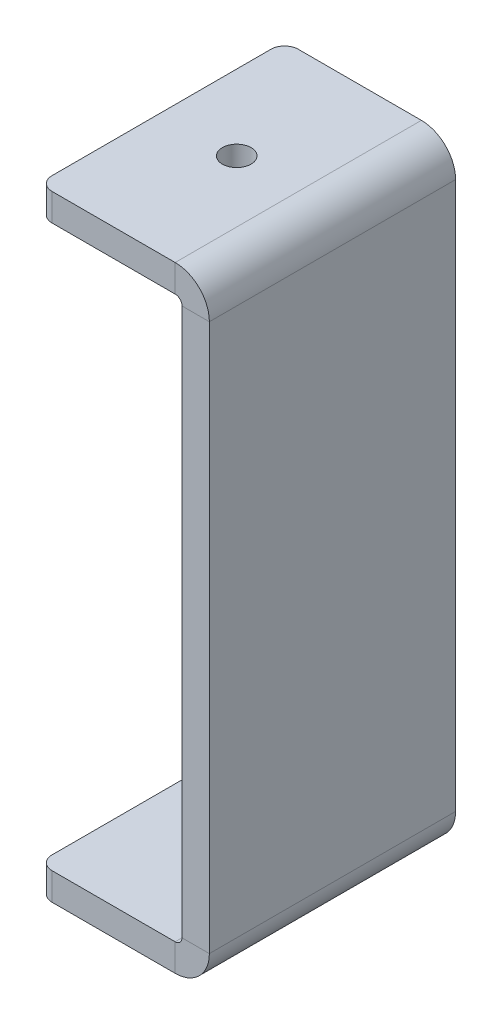
ISO-10303-21;
HEADER;
FILE_DESCRIPTION(('STEP AP214'),'2;1');
FILE_NAME('part.step','',(''),(''),'','','');
FILE_SCHEMA(('AUTOMOTIVE_DESIGN { 1 0 10303 214 1 1 1 1 }'));
ENDSEC;
DATA;
#1=APPLICATION_CONTEXT('core data for automotive mechanical design processes');
#2=APPLICATION_PROTOCOL_DEFINITION('international standard','automotive_design',2000,#1);
#3=PRODUCT_CONTEXT('',#1,'mechanical');
#4=PRODUCT('Part','Part','',(#3));
#5=PRODUCT_RELATED_PRODUCT_CATEGORY('part','',(#4));
#6=PRODUCT_DEFINITION_FORMATION('','',#4);
#7=PRODUCT_DEFINITION_CONTEXT('part definition',#1,'design');
#8=PRODUCT_DEFINITION('design','',#6,#7);
#9=PRODUCT_DEFINITION_SHAPE('','',#8);
#10=(LENGTH_UNIT() NAMED_UNIT(*) SI_UNIT(.MILLI.,.METRE.));
#11=(NAMED_UNIT(*) PLANE_ANGLE_UNIT() SI_UNIT($,.RADIAN.));
#12=(NAMED_UNIT(*) SI_UNIT($,.STERADIAN.) SOLID_ANGLE_UNIT());
#13=UNCERTAINTY_MEASURE_WITH_UNIT(LENGTH_MEASURE(1.E-05),#10,'distance_accuracy_value','');
#14=(GEOMETRIC_REPRESENTATION_CONTEXT(3) GLOBAL_UNCERTAINTY_ASSIGNED_CONTEXT((#13)) GLOBAL_UNIT_ASSIGNED_CONTEXT((#10,
#11,#12)) REPRESENTATION_CONTEXT('',''));
#15=CARTESIAN_POINT('',(0.,0.,0.));
#16=DIRECTION('',(0.,0.,1.));
#17=DIRECTION('',(1.,0.,0.));
#18=AXIS2_PLACEMENT_3D('',#15,#16,#17);
#19=CARTESIAN_POINT('',(0.,-45.,18.));
#20=DIRECTION('',(0.,1.,0.));
#21=DIRECTION('',(0.,0.,1.));
#22=AXIS2_PLACEMENT_3D('',#19,#20,#21);
#23=PLANE('',#22);
#24=DIRECTION('',(0.,0.,-1.));
#25=VECTOR('',#24,1.);
#26=CARTESIAN_POINT('',(-25.,-45.,18.));
#27=LINE('',#26,#25);
#28=CARTESIAN_POINT('',(-25.,-45.,16.));
#29=VERTEX_POINT('',#28);
#30=CARTESIAN_POINT('',(-25.,-45.,-16.));
#31=VERTEX_POINT('',#30);
#32=EDGE_CURVE('E244',#29,#31,#27,.T.);
#33=ORIENTED_EDGE('',*,*,#32,.T.);
#34=CARTESIAN_POINT('',(-23.,-45.,-16.));
#35=DIRECTION('',(0.,1.,0.));
#36=DIRECTION('',(0.,0.,1.));
#37=AXIS2_PLACEMENT_3D('',#34,#35,#36);
#38=CIRCLE('',#37,2.);
#39=CARTESIAN_POINT('',(-23.,-45.,-18.));
#40=VERTEX_POINT('',#39);
#41=EDGE_CURVE('E288',#31,#40,#38,.F.);
#42=ORIENTED_EDGE('',*,*,#41,.T.);
#43=DIRECTION('',(1.,0.,0.));
#44=VECTOR('',#43,1.);
#45=CARTESIAN_POINT('',(0.,-45.,-18.));
#46=LINE('',#45,#44);
#47=CARTESIAN_POINT('',(-4.99999999999999,-45.,-18.));
#48=VERTEX_POINT('',#47);
#49=EDGE_CURVE('E222',#40,#48,#46,.T.);
#50=ORIENTED_EDGE('',*,*,#49,.T.);
#51=DIRECTION('',(0.,0.,-1.));
#52=VECTOR('',#51,1.);
#53=CARTESIAN_POINT('',(-4.99999999999999,-45.,18.));
#54=LINE('',#53,#52);
#55=CARTESIAN_POINT('',(-4.99999999999999,-45.,18.));
#56=VERTEX_POINT('',#55);
#57=EDGE_CURVE('E241',#56,#48,#54,.T.);
#58=ORIENTED_EDGE('',*,*,#57,.F.);
#59=DIRECTION('',(1.,0.,0.));
#60=VECTOR('',#59,1.);
#61=CARTESIAN_POINT('',(0.,-45.,18.));
#62=LINE('',#61,#60);
#63=CARTESIAN_POINT('',(-23.,-45.,18.));
#64=VERTEX_POINT('',#63);
#65=EDGE_CURVE('E197',#64,#56,#62,.T.);
#66=ORIENTED_EDGE('',*,*,#65,.F.);
#67=CARTESIAN_POINT('',(-23.,-45.,16.));
#68=DIRECTION('',(0.,1.,0.));
#69=DIRECTION('',(0.,0.,1.));
#70=AXIS2_PLACEMENT_3D('',#67,#68,#69);
#71=CIRCLE('',#70,2.);
#72=EDGE_CURVE('E286',#64,#29,#71,.F.);
#73=ORIENTED_EDGE('',*,*,#72,.T.);
#74=EDGE_LOOP('',(#33,#42,#50,#58,#66,#73));
#75=FACE_BOUND('',#74,.T.);
#76=CARTESIAN_POINT('',(-14.,-45.,0.));
#77=DIRECTION('',(0.,-1.,0.));
#78=DIRECTION('',(0.,0.,-1.));
#79=AXIS2_PLACEMENT_3D('',#76,#77,#78);
#80=CIRCLE('',#79,2.1);
#81=CARTESIAN_POINT('',(-14.,-45.,-2.1));
#82=VERTEX_POINT('',#81);
#83=EDGE_CURVE('E328',#82,#82,#80,.T.);
#84=ORIENTED_EDGE('',*,*,#83,.F.);
#85=EDGE_LOOP('',(#84));
#86=FACE_BOUND('',#85,.T.);
#87=ADVANCED_FACE('F39',(#75,#86),#23,.F.);
#88=CARTESIAN_POINT('',(0.,45.,18.));
#89=DIRECTION('',(0.,-1.,0.));
#90=DIRECTION('',(0.,0.,-1.));
#91=AXIS2_PLACEMENT_3D('',#88,#89,#90);
#92=PLANE('',#91);
#93=DIRECTION('',(-1.,0.,0.));
#94=VECTOR('',#93,1.);
#95=CARTESIAN_POINT('',(0.,45.,-18.));
#96=LINE('',#95,#94);
#97=CARTESIAN_POINT('',(-4.99999999999999,45.,-18.));
#98=VERTEX_POINT('',#97);
#99=CARTESIAN_POINT('',(-23.,45.,-18.));
#100=VERTEX_POINT('',#99);
#101=EDGE_CURVE('E207',#98,#100,#96,.T.);
#102=ORIENTED_EDGE('',*,*,#101,.T.);
#103=CARTESIAN_POINT('',(-23.,45.,-16.));
#104=DIRECTION('',(0.,-1.,0.));
#105=DIRECTION('',(0.,0.,-1.));
#106=AXIS2_PLACEMENT_3D('',#103,#104,#105);
#107=CIRCLE('',#106,2.);
#108=CARTESIAN_POINT('',(-25.,45.,-16.));
#109=VERTEX_POINT('',#108);
#110=EDGE_CURVE('E297',#100,#109,#107,.F.);
#111=ORIENTED_EDGE('',*,*,#110,.T.);
#112=DIRECTION('',(0.,0.,-1.));
#113=VECTOR('',#112,1.);
#114=CARTESIAN_POINT('',(-25.,45.,18.));
#115=LINE('',#114,#113);
#116=CARTESIAN_POINT('',(-25.,45.,16.));
#117=VERTEX_POINT('',#116);
#118=EDGE_CURVE('E258',#117,#109,#115,.T.);
#119=ORIENTED_EDGE('',*,*,#118,.F.);
#120=CARTESIAN_POINT('',(-23.,45.,16.));
#121=DIRECTION('',(0.,-1.,0.));
#122=DIRECTION('',(0.,0.,-1.));
#123=AXIS2_PLACEMENT_3D('',#120,#121,#122);
#124=CIRCLE('',#123,2.);
#125=CARTESIAN_POINT('',(-23.,45.,18.));
#126=VERTEX_POINT('',#125);
#127=EDGE_CURVE('E295',#117,#126,#124,.F.);
#128=ORIENTED_EDGE('',*,*,#127,.T.);
#129=DIRECTION('',(-1.,0.,0.));
#130=VECTOR('',#129,1.);
#131=CARTESIAN_POINT('',(0.,45.,18.));
#132=LINE('',#131,#130);
#133=CARTESIAN_POINT('',(-4.99999999999999,45.,18.));
#134=VERTEX_POINT('',#133);
#135=EDGE_CURVE('E182',#134,#126,#132,.T.);
#136=ORIENTED_EDGE('',*,*,#135,.F.);
#137=DIRECTION('',(0.,0.,-1.));
#138=VECTOR('',#137,1.);
#139=CARTESIAN_POINT('',(-4.99999999999999,45.,18.));
#140=LINE('',#139,#138);
#141=EDGE_CURVE('E206',#134,#98,#140,.T.);
#142=ORIENTED_EDGE('',*,*,#141,.T.);
#143=EDGE_LOOP('',(#102,#111,#119,#128,#136,#142));
#144=FACE_BOUND('',#143,.T.);
#145=CARTESIAN_POINT('',(-14.,45.,0.));
#146=DIRECTION('',(0.,1.,0.));
#147=DIRECTION('',(0.,0.,1.));
#148=AXIS2_PLACEMENT_3D('',#145,#146,#147);
#149=CIRCLE('',#148,2.1);
#150=CARTESIAN_POINT('',(-14.,45.,2.1));
#151=VERTEX_POINT('',#150);
#152=EDGE_CURVE('E322',#151,#151,#149,.T.);
#153=ORIENTED_EDGE('',*,*,#152,.F.);
#154=EDGE_LOOP('',(#153));
#155=FACE_BOUND('',#154,.T.);
#156=ADVANCED_FACE('F313',(#144,#155),#92,.F.);
#157=CARTESIAN_POINT('',(-4.99999999999999,-45.,18.));
#158=DIRECTION('',(0.,0.,1.));
#159=DIRECTION('',(1.,0.,0.));
#160=AXIS2_PLACEMENT_3D('',#157,#158,#159);
#161=PLANE('',#160);
#162=DIRECTION('',(0.,1.,0.));
#163=VECTOR('',#162,1.);
#164=CARTESIAN_POINT('',(-4.99999999999999,-45.,18.));
#165=LINE('',#164,#163);
#166=CARTESIAN_POINT('',(-4.99999999999999,-41.,18.));
#167=VERTEX_POINT('',#166);
#168=EDGE_CURVE('E271',#56,#167,#165,.T.);
#169=ORIENTED_EDGE('',*,*,#168,.F.);
#170=CARTESIAN_POINT('',(-4.99999999999999,-40.,18.));
#171=DIRECTION('',(0.,0.,-1.));
#172=DIRECTION('',(-1.,0.,0.));
#173=AXIS2_PLACEMENT_3D('',#170,#171,#172);
#174=CIRCLE('',#173,5.);
#175=CARTESIAN_POINT('',(0.,-39.9999999999999,18.));
#176=VERTEX_POINT('',#175);
#177=EDGE_CURVE('E199',#56,#176,#174,.F.);
#178=ORIENTED_EDGE('',*,*,#177,.T.);
#179=DIRECTION('',(1.,0.,0.));
#180=VECTOR('',#179,1.);
#181=CARTESIAN_POINT('',(-3.99999999999999,-39.9999999999999,18.));
#182=LINE('',#181,#180);
#183=CARTESIAN_POINT('',(-3.99999999999999,-39.9999999999999,18.));
#184=VERTEX_POINT('',#183);
#185=EDGE_CURVE('E269',#184,#176,#182,.T.);
#186=ORIENTED_EDGE('',*,*,#185,.F.);
#187=CARTESIAN_POINT('',(-4.99999999999999,-40.,18.));
#188=DIRECTION('',(0.,0.,1.));
#189=DIRECTION('',(1.,0.,0.));
#190=AXIS2_PLACEMENT_3D('',#187,#188,#189);
#191=CIRCLE('',#190,1.);
#192=EDGE_CURVE('E189',#167,#184,#191,.T.);
#193=ORIENTED_EDGE('',*,*,#192,.F.);
#194=EDGE_LOOP('',(#169,#178,#186,#193));
#195=FACE_BOUND('',#194,.T.);
#196=ADVANCED_FACE('F341',(#195),#161,.T.);
#197=CARTESIAN_POINT('',(-3.99999999999999,-39.9999999999999,18.));
#198=DIRECTION('',(0.,0.,1.));
#199=DIRECTION('',(1.,0.,0.));
#200=AXIS2_PLACEMENT_3D('',#197,#198,#199);
#201=PLANE('',#200);
#202=DIRECTION('',(1.,0.,0.));
#203=VECTOR('',#202,1.);
#204=CARTESIAN_POINT('',(0.,-41.,18.));
#205=LINE('',#204,#203);
#206=CARTESIAN_POINT('',(-23.,-41.,18.));
#207=VERTEX_POINT('',#206);
#208=EDGE_CURVE('E195',#207,#167,#205,.T.);
#209=ORIENTED_EDGE('',*,*,#208,.F.);
#210=DIRECTION('',(0.,1.,0.));
#211=VECTOR('',#210,1.);
#212=CARTESIAN_POINT('',(-23.,-39.9999999999999,18.));
#213=LINE('',#212,#211);
#214=EDGE_CURVE('E290',#207,#64,#213,.F.);
#215=ORIENTED_EDGE('',*,*,#214,.T.);
#216=ORIENTED_EDGE('',*,*,#65,.T.);
#217=ORIENTED_EDGE('',*,*,#168,.T.);
#218=EDGE_LOOP('',(#209,#215,#216,#217));
#219=FACE_BOUND('',#218,.T.);
#220=ADVANCED_FACE('F389',(#219),#201,.T.);
#221=CARTESIAN_POINT('',(0.,-39.9999999999999,-18.));
#222=DIRECTION('',(0.,0.,-1.));
#223=DIRECTION('',(-1.,0.,0.));
#224=AXIS2_PLACEMENT_3D('',#221,#222,#223);
#225=PLANE('',#224);
#226=DIRECTION('',(-1.,0.,0.));
#227=VECTOR('',#226,1.);
#228=CARTESIAN_POINT('',(0.,-39.9999999999999,-18.));
#229=LINE('',#228,#227);
#230=CARTESIAN_POINT('',(0.,-39.9999999999999,-18.));
#231=VERTEX_POINT('',#230);
#232=CARTESIAN_POINT('',(-3.99999999999999,-39.9999999999999,-18.));
#233=VERTEX_POINT('',#232);
#234=EDGE_CURVE('E267',#231,#233,#229,.T.);
#235=ORIENTED_EDGE('',*,*,#234,.F.);
#236=CARTESIAN_POINT('',(-4.99999999999999,-40.,-18.));
#237=DIRECTION('',(0.,0.,-1.));
#238=DIRECTION('',(-1.,0.,0.));
#239=AXIS2_PLACEMENT_3D('',#236,#237,#238);
#240=CIRCLE('',#239,5.);
#241=EDGE_CURVE('E224',#48,#231,#240,.F.);
#242=ORIENTED_EDGE('',*,*,#241,.F.);
#243=DIRECTION('',(0.,-1.,0.));
#244=VECTOR('',#243,1.);
#245=CARTESIAN_POINT('',(-4.99999999999999,-41.,-18.));
#246=LINE('',#245,#244);
#247=CARTESIAN_POINT('',(-4.99999999999999,-41.,-18.));
#248=VERTEX_POINT('',#247);
#249=EDGE_CURVE('E264',#248,#48,#246,.T.);
#250=ORIENTED_EDGE('',*,*,#249,.F.);
#251=CARTESIAN_POINT('',(-4.99999999999999,-40.,-18.));
#252=DIRECTION('',(0.,0.,1.));
#253=DIRECTION('',(1.,0.,0.));
#254=AXIS2_PLACEMENT_3D('',#251,#252,#253);
#255=CIRCLE('',#254,1.);
#256=EDGE_CURVE('E217',#248,#233,#255,.T.);
#257=ORIENTED_EDGE('',*,*,#256,.T.);
#258=EDGE_LOOP('',(#235,#242,#250,#257));
#259=FACE_BOUND('',#258,.T.);
#260=ADVANCED_FACE('F385',(#259),#225,.T.);
#261=CARTESIAN_POINT('',(-4.99999999999999,-41.,-18.));
#262=DIRECTION('',(0.,0.,-1.));
#263=DIRECTION('',(-1.,0.,0.));
#264=AXIS2_PLACEMENT_3D('',#261,#262,#263);
#265=PLANE('',#264);
#266=DIRECTION('',(0.,1.,0.));
#267=VECTOR('',#266,1.);
#268=CARTESIAN_POINT('',(0.,45.,-18.));
#269=LINE('',#268,#267);
#270=CARTESIAN_POINT('',(0.,40.,-18.));
#271=VERTEX_POINT('',#270);
#272=EDGE_CURVE('E227',#231,#271,#269,.T.);
#273=ORIENTED_EDGE('',*,*,#272,.F.);
#274=ORIENTED_EDGE('',*,*,#234,.T.);
#275=DIRECTION('',(0.,1.,0.));
#276=VECTOR('',#275,1.);
#277=CARTESIAN_POINT('',(-3.99999999999999,45.,-18.));
#278=LINE('',#277,#276);
#279=CARTESIAN_POINT('',(-3.99999999999999,40.,-18.));
#280=VERTEX_POINT('',#279);
#281=EDGE_CURVE('E214',#233,#280,#278,.T.);
#282=ORIENTED_EDGE('',*,*,#281,.T.);
#283=DIRECTION('',(1.,0.,0.));
#284=VECTOR('',#283,1.);
#285=CARTESIAN_POINT('',(-3.99999999999999,40.,-18.));
#286=LINE('',#285,#284);
#287=EDGE_CURVE('E260',#280,#271,#286,.T.);
#288=ORIENTED_EDGE('',*,*,#287,.T.);
#289=EDGE_LOOP('',(#273,#274,#282,#288));
#290=FACE_BOUND('',#289,.T.);
#291=ADVANCED_FACE('F382',(#290),#265,.T.);
#292=CARTESIAN_POINT('',(0.,40.,18.));
#293=DIRECTION('',(0.,0.,1.));
#294=DIRECTION('',(1.,0.,0.));
#295=AXIS2_PLACEMENT_3D('',#292,#293,#294);
#296=PLANE('',#295);
#297=DIRECTION('',(-1.,0.,0.));
#298=VECTOR('',#297,1.);
#299=CARTESIAN_POINT('',(0.,40.,18.));
#300=LINE('',#299,#298);
#301=CARTESIAN_POINT('',(0.,40.,18.));
#302=VERTEX_POINT('',#301);
#303=CARTESIAN_POINT('',(-3.99999999999999,40.,18.));
#304=VERTEX_POINT('',#303);
#305=EDGE_CURVE('E163',#302,#304,#300,.T.);
#306=ORIENTED_EDGE('',*,*,#305,.F.);
#307=CARTESIAN_POINT('',(-4.99999999999999,40.,18.));
#308=DIRECTION('',(0.,0.,-1.));
#309=DIRECTION('',(-1.,0.,0.));
#310=AXIS2_PLACEMENT_3D('',#307,#308,#309);
#311=CIRCLE('',#310,5.);
#312=EDGE_CURVE('E161',#302,#134,#311,.F.);
#313=ORIENTED_EDGE('',*,*,#312,.T.);
#314=DIRECTION('',(0.,1.,0.));
#315=VECTOR('',#314,1.);
#316=CARTESIAN_POINT('',(-4.99999999999999,41.,18.));
#317=LINE('',#316,#315);
#318=CARTESIAN_POINT('',(-4.99999999999999,41.,18.));
#319=VERTEX_POINT('',#318);
#320=EDGE_CURVE('E154',#319,#134,#317,.T.);
#321=ORIENTED_EDGE('',*,*,#320,.F.);
#322=CARTESIAN_POINT('',(-4.99999999999999,40.,18.));
#323=DIRECTION('',(0.,0.,1.));
#324=DIRECTION('',(1.,0.,0.));
#325=AXIS2_PLACEMENT_3D('',#322,#323,#324);
#326=CIRCLE('',#325,1.);
#327=EDGE_CURVE('E158',#304,#319,#326,.T.);
#328=ORIENTED_EDGE('',*,*,#327,.F.);
#329=EDGE_LOOP('',(#306,#313,#321,#328));
#330=FACE_BOUND('',#329,.T.);
#331=ADVANCED_FACE('F156',(#330),#296,.T.);
#332=CARTESIAN_POINT('',(-4.99999999999999,41.,18.));
#333=DIRECTION('',(0.,0.,1.));
#334=DIRECTION('',(1.,0.,0.));
#335=AXIS2_PLACEMENT_3D('',#332,#333,#334);
#336=PLANE('',#335);
#337=DIRECTION('',(0.,1.,0.));
#338=VECTOR('',#337,1.);
#339=CARTESIAN_POINT('',(0.,45.,18.));
#340=LINE('',#339,#338);
#341=EDGE_CURVE('E202',#176,#302,#340,.T.);
#342=ORIENTED_EDGE('',*,*,#341,.T.);
#343=ORIENTED_EDGE('',*,*,#305,.T.);
#344=DIRECTION('',(0.,1.,0.));
#345=VECTOR('',#344,1.);
#346=CARTESIAN_POINT('',(-3.99999999999999,45.,18.));
#347=LINE('',#346,#345);
#348=EDGE_CURVE('E187',#184,#304,#347,.T.);
#349=ORIENTED_EDGE('',*,*,#348,.F.);
#350=ORIENTED_EDGE('',*,*,#185,.T.);
#351=EDGE_LOOP('',(#342,#343,#349,#350));
#352=FACE_BOUND('',#351,.T.);
#353=ADVANCED_FACE('F375',(#352),#336,.T.);
#354=CARTESIAN_POINT('',(-4.99999999999999,45.,-18.));
#355=DIRECTION('',(0.,0.,-1.));
#356=DIRECTION('',(-1.,0.,0.));
#357=AXIS2_PLACEMENT_3D('',#354,#355,#356);
#358=PLANE('',#357);
#359=DIRECTION('',(0.,-1.,0.));
#360=VECTOR('',#359,1.);
#361=CARTESIAN_POINT('',(-4.99999999999999,45.,-18.));
#362=LINE('',#361,#360);
#363=CARTESIAN_POINT('',(-4.99999999999999,41.,-18.));
#364=VERTEX_POINT('',#363);
#365=EDGE_CURVE('E164',#98,#364,#362,.T.);
#366=ORIENTED_EDGE('',*,*,#365,.F.);
#367=CARTESIAN_POINT('',(-4.99999999999999,40.,-18.));
#368=DIRECTION('',(0.,0.,-1.));
#369=DIRECTION('',(-1.,0.,0.));
#370=AXIS2_PLACEMENT_3D('',#367,#368,#369);
#371=CIRCLE('',#370,5.);
#372=EDGE_CURVE('E230',#271,#98,#371,.F.);
#373=ORIENTED_EDGE('',*,*,#372,.F.);
#374=ORIENTED_EDGE('',*,*,#287,.F.);
#375=CARTESIAN_POINT('',(-4.99999999999999,40.,-18.));
#376=DIRECTION('',(0.,0.,1.));
#377=DIRECTION('',(1.,0.,0.));
#378=AXIS2_PLACEMENT_3D('',#375,#376,#377);
#379=CIRCLE('',#378,1.);
#380=EDGE_CURVE('E212',#280,#364,#379,.T.);
#381=ORIENTED_EDGE('',*,*,#380,.T.);
#382=EDGE_LOOP('',(#366,#373,#374,#381));
#383=FACE_BOUND('',#382,.T.);
#384=ADVANCED_FACE('F372',(#383),#358,.T.);
#385=CARTESIAN_POINT('',(-3.99999999999999,40.,-18.));
#386=DIRECTION('',(0.,0.,-1.));
#387=DIRECTION('',(-1.,0.,0.));
#388=AXIS2_PLACEMENT_3D('',#385,#386,#387);
#389=PLANE('',#388);
#390=DIRECTION('',(1.,0.,0.));
#391=VECTOR('',#390,1.);
#392=CARTESIAN_POINT('',(0.,41.,-18.));
#393=LINE('',#392,#391);
#394=CARTESIAN_POINT('',(-23.,41.,-18.));
#395=VERTEX_POINT('',#394);
#396=EDGE_CURVE('E174',#364,#395,#393,.F.);
#397=ORIENTED_EDGE('',*,*,#396,.T.);
#398=DIRECTION('',(0.,1.,0.));
#399=VECTOR('',#398,1.);
#400=CARTESIAN_POINT('',(-23.,40.,-18.));
#401=LINE('',#400,#399);
#402=EDGE_CURVE('E292',#395,#100,#401,.T.);
#403=ORIENTED_EDGE('',*,*,#402,.T.);
#404=ORIENTED_EDGE('',*,*,#101,.F.);
#405=ORIENTED_EDGE('',*,*,#365,.T.);
#406=EDGE_LOOP('',(#397,#403,#404,#405));
#407=FACE_BOUND('',#406,.T.);
#408=ADVANCED_FACE('F308',(#407),#389,.T.);
#409=CARTESIAN_POINT('',(-25.,41.,18.));
#410=DIRECTION('',(-1.,0.,0.));
#411=DIRECTION('',(0.,0.,1.));
#412=AXIS2_PLACEMENT_3D('',#409,#410,#411);
#413=PLANE('',#412);
#414=ORIENTED_EDGE('',*,*,#118,.T.);
#415=DIRECTION('',(0.,1.,0.));
#416=VECTOR('',#415,1.);
#417=CARTESIAN_POINT('',(-25.,41.,-16.));
#418=LINE('',#417,#416);
#419=CARTESIAN_POINT('',(-25.,41.,-16.));
#420=VERTEX_POINT('',#419);
#421=EDGE_CURVE('E60',#109,#420,#418,.F.);
#422=ORIENTED_EDGE('',*,*,#421,.T.);
#423=DIRECTION('',(0.,0.,-1.));
#424=VECTOR('',#423,1.);
#425=CARTESIAN_POINT('',(-25.,41.,18.));
#426=LINE('',#425,#424);
#427=CARTESIAN_POINT('',(-25.,41.,16.));
#428=VERTEX_POINT('',#427);
#429=EDGE_CURVE('E178',#428,#420,#426,.T.);
#430=ORIENTED_EDGE('',*,*,#429,.F.);
#431=DIRECTION('',(0.,1.,0.));
#432=VECTOR('',#431,1.);
#433=CARTESIAN_POINT('',(-25.,41.,16.));
#434=LINE('',#433,#432);
#435=EDGE_CURVE('E299',#428,#117,#434,.T.);
#436=ORIENTED_EDGE('',*,*,#435,.T.);
#437=EDGE_LOOP('',(#414,#422,#430,#436));
#438=FACE_BOUND('',#437,.T.);
#439=ADVANCED_FACE('F315',(#438),#413,.T.);
#440=CARTESIAN_POINT('',(0.,41.,18.));
#441=DIRECTION('',(0.,-1.,0.));
#442=DIRECTION('',(0.,0.,-1.));
#443=AXIS2_PLACEMENT_3D('',#440,#441,#442);
#444=PLANE('',#443);
#445=CARTESIAN_POINT('',(-14.,41.,0.));
#446=DIRECTION('',(0.,-1.,0.));
#447=DIRECTION('',(0.,0.,-1.));
#448=AXIS2_PLACEMENT_3D('',#445,#446,#447);
#449=CIRCLE('',#448,2.1);
#450=CARTESIAN_POINT('',(-14.,41.,-2.1));
#451=VERTEX_POINT('',#450);
#452=EDGE_CURVE('E210',#451,#451,#449,.T.);
#453=ORIENTED_EDGE('',*,*,#452,.F.);
#454=EDGE_LOOP('',(#453));
#455=FACE_BOUND('',#454,.T.);
#456=ORIENTED_EDGE('',*,*,#429,.T.);
#457=CARTESIAN_POINT('',(-23.,41.,-16.));
#458=DIRECTION('',(0.,-1.,0.));
#459=DIRECTION('',(0.,0.,-1.));
#460=AXIS2_PLACEMENT_3D('',#457,#458,#459);
#461=CIRCLE('',#460,2.);
#462=EDGE_CURVE('E47',#420,#395,#461,.T.);
#463=ORIENTED_EDGE('',*,*,#462,.T.);
#464=ORIENTED_EDGE('',*,*,#396,.F.);
#465=DIRECTION('',(0.,0.,-1.));
#466=VECTOR('',#465,1.);
#467=CARTESIAN_POINT('',(-4.99999999999999,41.,18.));
#468=LINE('',#467,#466);
#469=EDGE_CURVE('E169',#319,#364,#468,.T.);
#470=ORIENTED_EDGE('',*,*,#469,.F.);
#471=DIRECTION('',(1.,0.,0.));
#472=VECTOR('',#471,1.);
#473=CARTESIAN_POINT('',(0.,41.,18.));
#474=LINE('',#473,#472);
#475=CARTESIAN_POINT('',(-23.,41.,18.));
#476=VERTEX_POINT('',#475);
#477=EDGE_CURVE('E171',#319,#476,#474,.F.);
#478=ORIENTED_EDGE('',*,*,#477,.T.);
#479=CARTESIAN_POINT('',(-23.,41.,16.));
#480=DIRECTION('',(0.,-1.,0.));
#481=DIRECTION('',(0.,0.,-1.));
#482=AXIS2_PLACEMENT_3D('',#479,#480,#481);
#483=CIRCLE('',#482,2.);
#484=EDGE_CURVE('E303',#476,#428,#483,.T.);
#485=ORIENTED_EDGE('',*,*,#484,.T.);
#486=EDGE_LOOP('',(#456,#463,#464,#470,#478,#485));
#487=FACE_BOUND('',#486,.T.);
#488=ADVANCED_FACE('F170',(#455,#487),#444,.T.);
#489=CARTESIAN_POINT('',(-4.99999999999999,40.,18.));
#490=DIRECTION('',(0.,0.,-1.));
#491=DIRECTION('',(-1.,0.,0.));
#492=AXIS2_PLACEMENT_3D('',#489,#490,#491);
#493=CYLINDRICAL_SURFACE('',#492,1.);
#494=ORIENTED_EDGE('',*,*,#380,.F.);
#495=DIRECTION('',(0.,0.,-1.));
#496=VECTOR('',#495,1.);
#497=CARTESIAN_POINT('',(-3.99999999999999,40.,18.));
#498=LINE('',#497,#496);
#499=EDGE_CURVE('E179',#304,#280,#498,.T.);
#500=ORIENTED_EDGE('',*,*,#499,.F.);
#501=ORIENTED_EDGE('',*,*,#327,.T.);
#502=ORIENTED_EDGE('',*,*,#469,.T.);
#503=EDGE_LOOP('',(#494,#500,#501,#502));
#504=FACE_BOUND('',#503,.T.);
#505=ADVANCED_FACE('F185',(#504),#493,.F.);
#506=CARTESIAN_POINT('',(-3.99999999999999,45.,18.));
#507=DIRECTION('',(-1.,0.,0.));
#508=DIRECTION('',(0.,0.,1.));
#509=AXIS2_PLACEMENT_3D('',#506,#507,#508);
#510=PLANE('',#509);
#511=ORIENTED_EDGE('',*,*,#281,.F.);
#512=DIRECTION('',(0.,0.,-1.));
#513=VECTOR('',#512,1.);
#514=CARTESIAN_POINT('',(-3.99999999999999,-39.9999999999999,18.));
#515=LINE('',#514,#513);
#516=EDGE_CURVE('E253',#184,#233,#515,.T.);
#517=ORIENTED_EDGE('',*,*,#516,.F.);
#518=ORIENTED_EDGE('',*,*,#348,.T.);
#519=ORIENTED_EDGE('',*,*,#499,.T.);
#520=EDGE_LOOP('',(#511,#517,#518,#519));
#521=FACE_BOUND('',#520,.T.);
#522=ADVANCED_FACE('F358',(#521),#510,.T.);
#523=CARTESIAN_POINT('',(-4.99999999999999,-40.,18.));
#524=DIRECTION('',(0.,0.,-1.));
#525=DIRECTION('',(-1.,0.,0.));
#526=AXIS2_PLACEMENT_3D('',#523,#524,#525);
#527=CYLINDRICAL_SURFACE('',#526,1.);
#528=ORIENTED_EDGE('',*,*,#256,.F.);
#529=DIRECTION('',(0.,0.,-1.));
#530=VECTOR('',#529,1.);
#531=CARTESIAN_POINT('',(-4.99999999999999,-41.,18.));
#532=LINE('',#531,#530);
#533=EDGE_CURVE('E250',#167,#248,#532,.T.);
#534=ORIENTED_EDGE('',*,*,#533,.F.);
#535=ORIENTED_EDGE('',*,*,#192,.T.);
#536=ORIENTED_EDGE('',*,*,#516,.T.);
#537=EDGE_LOOP('',(#528,#534,#535,#536));
#538=FACE_BOUND('',#537,.T.);
#539=ADVANCED_FACE('F354',(#538),#527,.F.);
#540=CARTESIAN_POINT('',(0.,-41.,18.));
#541=DIRECTION('',(0.,1.,0.));
#542=DIRECTION('',(0.,0.,1.));
#543=AXIS2_PLACEMENT_3D('',#540,#541,#542);
#544=PLANE('',#543);
#545=CARTESIAN_POINT('',(-14.,-41.,0.));
#546=DIRECTION('',(0.,1.,0.));
#547=DIRECTION('',(0.,0.,1.));
#548=AXIS2_PLACEMENT_3D('',#545,#546,#547);
#549=CIRCLE('',#548,2.1);
#550=CARTESIAN_POINT('',(-14.,-41.,2.1));
#551=VERTEX_POINT('',#550);
#552=EDGE_CURVE('E325',#551,#551,#549,.T.);
#553=ORIENTED_EDGE('',*,*,#552,.F.);
#554=EDGE_LOOP('',(#553));
#555=FACE_BOUND('',#554,.T.);
#556=DIRECTION('',(1.,0.,0.));
#557=VECTOR('',#556,1.);
#558=CARTESIAN_POINT('',(0.,-41.,-18.));
#559=LINE('',#558,#557);
#560=CARTESIAN_POINT('',(-23.,-41.,-18.));
#561=VERTEX_POINT('',#560);
#562=EDGE_CURVE('E220',#561,#248,#559,.T.);
#563=ORIENTED_EDGE('',*,*,#562,.F.);
#564=CARTESIAN_POINT('',(-23.,-41.,-16.));
#565=DIRECTION('',(0.,1.,0.));
#566=DIRECTION('',(0.,0.,1.));
#567=AXIS2_PLACEMENT_3D('',#564,#565,#566);
#568=CIRCLE('',#567,2.);
#569=CARTESIAN_POINT('',(-25.,-41.,-16.));
#570=VERTEX_POINT('',#569);
#571=EDGE_CURVE('E279',#561,#570,#568,.T.);
#572=ORIENTED_EDGE('',*,*,#571,.T.);
#573=DIRECTION('',(0.,0.,-1.));
#574=VECTOR('',#573,1.);
#575=CARTESIAN_POINT('',(-25.,-41.,18.));
#576=LINE('',#575,#574);
#577=CARTESIAN_POINT('',(-25.,-41.,16.));
#578=VERTEX_POINT('',#577);
#579=EDGE_CURVE('E247',#578,#570,#576,.T.);
#580=ORIENTED_EDGE('',*,*,#579,.F.);
#581=CARTESIAN_POINT('',(-23.,-41.,16.));
#582=DIRECTION('',(0.,1.,0.));
#583=DIRECTION('',(0.,0.,1.));
#584=AXIS2_PLACEMENT_3D('',#581,#582,#583);
#585=CIRCLE('',#584,2.);
#586=EDGE_CURVE('E277',#578,#207,#585,.T.);
#587=ORIENTED_EDGE('',*,*,#586,.T.);
#588=ORIENTED_EDGE('',*,*,#208,.T.);
#589=ORIENTED_EDGE('',*,*,#533,.T.);
#590=EDGE_LOOP('',(#563,#572,#580,#587,#588,#589));
#591=FACE_BOUND('',#590,.T.);
#592=ADVANCED_FACE('F350',(#555,#591),#544,.T.);
#593=CARTESIAN_POINT('',(-25.,-45.,18.));
#594=DIRECTION('',(-1.,0.,0.));
#595=DIRECTION('',(0.,0.,1.));
#596=AXIS2_PLACEMENT_3D('',#593,#594,#595);
#597=PLANE('',#596);
#598=ORIENTED_EDGE('',*,*,#579,.T.);
#599=DIRECTION('',(0.,1.,0.));
#600=VECTOR('',#599,1.);
#601=CARTESIAN_POINT('',(-25.,-45.,-16.));
#602=LINE('',#601,#600);
#603=EDGE_CURVE('E284',#570,#31,#602,.F.);
#604=ORIENTED_EDGE('',*,*,#603,.T.);
#605=ORIENTED_EDGE('',*,*,#32,.F.);
#606=DIRECTION('',(0.,1.,0.));
#607=VECTOR('',#606,1.);
#608=CARTESIAN_POINT('',(-25.,-45.,16.));
#609=LINE('',#608,#607);
#610=EDGE_CURVE('E281',#29,#578,#609,.T.);
#611=ORIENTED_EDGE('',*,*,#610,.T.);
#612=EDGE_LOOP('',(#598,#604,#605,#611));
#613=FACE_BOUND('',#612,.T.);
#614=ADVANCED_FACE('F347',(#613),#597,.T.);
#615=CARTESIAN_POINT('',(-4.99999999999999,-40.,18.));
#616=DIRECTION('',(0.,0.,-1.));
#617=DIRECTION('',(-1.,0.,0.));
#618=AXIS2_PLACEMENT_3D('',#615,#616,#617);
#619=CYLINDRICAL_SURFACE('',#618,5.);
#620=ORIENTED_EDGE('',*,*,#241,.T.);
#621=DIRECTION('',(0.,0.,-1.));
#622=VECTOR('',#621,1.);
#623=CARTESIAN_POINT('',(0.,-39.9999999999999,18.));
#624=LINE('',#623,#622);
#625=EDGE_CURVE('E238',#176,#231,#624,.T.);
#626=ORIENTED_EDGE('',*,*,#625,.F.);
#627=ORIENTED_EDGE('',*,*,#177,.F.);
#628=ORIENTED_EDGE('',*,*,#57,.T.);
#629=EDGE_LOOP('',(#620,#626,#627,#628));
#630=FACE_BOUND('',#629,.T.);
#631=ADVANCED_FACE('F345',(#630),#619,.T.);
#632=CARTESIAN_POINT('',(0.,45.,18.));
#633=DIRECTION('',(-1.,0.,0.));
#634=DIRECTION('',(0.,0.,1.));
#635=AXIS2_PLACEMENT_3D('',#632,#633,#634);
#636=PLANE('',#635);
#637=ORIENTED_EDGE('',*,*,#272,.T.);
#638=DIRECTION('',(0.,0.,-1.));
#639=VECTOR('',#638,1.);
#640=CARTESIAN_POINT('',(0.,40.,18.));
#641=LINE('',#640,#639);
#642=EDGE_CURVE('E235',#302,#271,#641,.T.);
#643=ORIENTED_EDGE('',*,*,#642,.F.);
#644=ORIENTED_EDGE('',*,*,#341,.F.);
#645=ORIENTED_EDGE('',*,*,#625,.T.);
#646=EDGE_LOOP('',(#637,#643,#644,#645));
#647=FACE_BOUND('',#646,.T.);
#648=ADVANCED_FACE('F428',(#647),#636,.F.);
#649=CARTESIAN_POINT('',(-4.99999999999999,40.,18.));
#650=DIRECTION('',(0.,0.,-1.));
#651=DIRECTION('',(-1.,0.,0.));
#652=AXIS2_PLACEMENT_3D('',#649,#650,#651);
#653=CYLINDRICAL_SURFACE('',#652,5.);
#654=ORIENTED_EDGE('',*,*,#372,.T.);
#655=ORIENTED_EDGE('',*,*,#141,.F.);
#656=ORIENTED_EDGE('',*,*,#312,.F.);
#657=ORIENTED_EDGE('',*,*,#642,.T.);
#658=EDGE_LOOP('',(#654,#655,#656,#657));
#659=FACE_BOUND('',#658,.T.);
#660=ADVANCED_FACE('F423',(#659),#653,.T.);
#661=CARTESIAN_POINT('',(-4.99999999999999,40.,18.));
#662=DIRECTION('',(0.,0.,1.));
#663=DIRECTION('',(1.,0.,0.));
#664=AXIS2_PLACEMENT_3D('',#661,#662,#663);
#665=PLANE('',#664);
#666=ORIENTED_EDGE('',*,*,#135,.T.);
#667=DIRECTION('',(0.,1.,0.));
#668=VECTOR('',#667,1.);
#669=CARTESIAN_POINT('',(-23.,40.,18.));
#670=LINE('',#669,#668);
#671=EDGE_CURVE('E11',#126,#476,#670,.F.);
#672=ORIENTED_EDGE('',*,*,#671,.T.);
#673=ORIENTED_EDGE('',*,*,#477,.F.);
#674=ORIENTED_EDGE('',*,*,#320,.T.);
#675=EDGE_LOOP('',(#666,#672,#673,#674));
#676=FACE_BOUND('',#675,.T.);
#677=ADVANCED_FACE('F181',(#676),#665,.T.);
#678=CARTESIAN_POINT('',(-4.99999999999999,40.,-18.));
#679=DIRECTION('',(0.,0.,1.));
#680=DIRECTION('',(1.,0.,0.));
#681=AXIS2_PLACEMENT_3D('',#678,#679,#680);
#682=PLANE('',#681);
#683=ORIENTED_EDGE('',*,*,#49,.F.);
#684=DIRECTION('',(0.,1.,0.));
#685=VECTOR('',#684,1.);
#686=CARTESIAN_POINT('',(-23.,-41.,-18.));
#687=LINE('',#686,#685);
#688=EDGE_CURVE('E274',#40,#561,#687,.T.);
#689=ORIENTED_EDGE('',*,*,#688,.T.);
#690=ORIENTED_EDGE('',*,*,#562,.T.);
#691=ORIENTED_EDGE('',*,*,#249,.T.);
#692=EDGE_LOOP('',(#683,#689,#690,#691));
#693=FACE_BOUND('',#692,.T.);
#694=ADVANCED_FACE('F401',(#693),#682,.F.);
#695=CARTESIAN_POINT('',(-23.,40.,-16.));
#696=DIRECTION('',(0.,-1.,0.));
#697=DIRECTION('',(0.,0.,-1.));
#698=AXIS2_PLACEMENT_3D('',#695,#696,#697);
#699=CYLINDRICAL_SURFACE('',#698,2.);
#700=ORIENTED_EDGE('',*,*,#41,.F.);
#701=ORIENTED_EDGE('',*,*,#603,.F.);
#702=ORIENTED_EDGE('',*,*,#571,.F.);
#703=ORIENTED_EDGE('',*,*,#688,.F.);
#704=EDGE_LOOP('',(#700,#701,#702,#703));
#705=FACE_BOUND('',#704,.T.);
#706=ADVANCED_FACE('F397',(#705),#699,.T.);
#707=CARTESIAN_POINT('',(-23.,-45.,16.));
#708=DIRECTION('',(0.,1.,0.));
#709=DIRECTION('',(0.,0.,1.));
#710=AXIS2_PLACEMENT_3D('',#707,#708,#709);
#711=CYLINDRICAL_SURFACE('',#710,2.);
#712=ORIENTED_EDGE('',*,*,#72,.F.);
#713=ORIENTED_EDGE('',*,*,#214,.F.);
#714=ORIENTED_EDGE('',*,*,#586,.F.);
#715=ORIENTED_EDGE('',*,*,#610,.F.);
#716=EDGE_LOOP('',(#712,#713,#714,#715));
#717=FACE_BOUND('',#716,.T.);
#718=ADVANCED_FACE('F400',(#717),#711,.T.);
#719=CARTESIAN_POINT('',(-23.,40.,-16.));
#720=DIRECTION('',(0.,1.,0.));
#721=DIRECTION('',(0.,0.,1.));
#722=AXIS2_PLACEMENT_3D('',#719,#720,#721);
#723=CYLINDRICAL_SURFACE('',#722,2.);
#724=ORIENTED_EDGE('',*,*,#462,.F.);
#725=ORIENTED_EDGE('',*,*,#421,.F.);
#726=ORIENTED_EDGE('',*,*,#110,.F.);
#727=ORIENTED_EDGE('',*,*,#402,.F.);
#728=EDGE_LOOP('',(#724,#725,#726,#727));
#729=FACE_BOUND('',#728,.T.);
#730=ADVANCED_FACE('F310',(#729),#723,.T.);
#731=CARTESIAN_POINT('',(-23.,41.,16.));
#732=DIRECTION('',(0.,1.,0.));
#733=DIRECTION('',(0.,0.,1.));
#734=AXIS2_PLACEMENT_3D('',#731,#732,#733);
#735=CYLINDRICAL_SURFACE('',#734,2.);
#736=ORIENTED_EDGE('',*,*,#484,.F.);
#737=ORIENTED_EDGE('',*,*,#671,.F.);
#738=ORIENTED_EDGE('',*,*,#127,.F.);
#739=ORIENTED_EDGE('',*,*,#435,.F.);
#740=EDGE_LOOP('',(#736,#737,#738,#739));
#741=FACE_BOUND('',#740,.T.);
#742=ADVANCED_FACE('F41',(#741),#735,.T.);
#743=CARTESIAN_POINT('',(-14.,45.,0.));
#744=DIRECTION('',(0.,1.,0.));
#745=DIRECTION('',(0.,0.,1.));
#746=AXIS2_PLACEMENT_3D('',#743,#744,#745);
#747=CYLINDRICAL_SURFACE('',#746,2.1);
#748=ORIENTED_EDGE('',*,*,#152,.T.);
#749=EDGE_LOOP('',(#748));
#750=FACE_BOUND('',#749,.T.);
#751=ORIENTED_EDGE('',*,*,#452,.T.);
#752=EDGE_LOOP('',(#751));
#753=FACE_BOUND('',#752,.T.);
#754=ADVANCED_FACE('F409',(#750,#753),#747,.F.);
#755=CARTESIAN_POINT('',(-14.,-45.,0.));
#756=DIRECTION('',(0.,-1.,0.));
#757=DIRECTION('',(0.,0.,-1.));
#758=AXIS2_PLACEMENT_3D('',#755,#756,#757);
#759=CYLINDRICAL_SURFACE('',#758,2.1);
#760=ORIENTED_EDGE('',*,*,#83,.T.);
#761=EDGE_LOOP('',(#760));
#762=FACE_BOUND('',#761,.T.);
#763=ORIENTED_EDGE('',*,*,#552,.T.);
#764=EDGE_LOOP('',(#763));
#765=FACE_BOUND('',#764,.T.);
#766=ADVANCED_FACE('F332',(#762,#765),#759,.F.);
#767=CLOSED_SHELL('',(#87,#156,#196,#220,#260,#291,#331,#353,#384,#408,#439,#488,#505,#522,#539,
#592,#614,#631,#648,#660,#677,#694,#706,#718,#730,#742,#754,#766));
#768=MANIFOLD_SOLID_BREP('B2',#767);
#769=ADVANCED_BREP_SHAPE_REPRESENTATION('',(#18,#768),#14);
#770=SHAPE_DEFINITION_REPRESENTATION(#9,#769);
ENDSEC;
END-ISO-10303-21;
